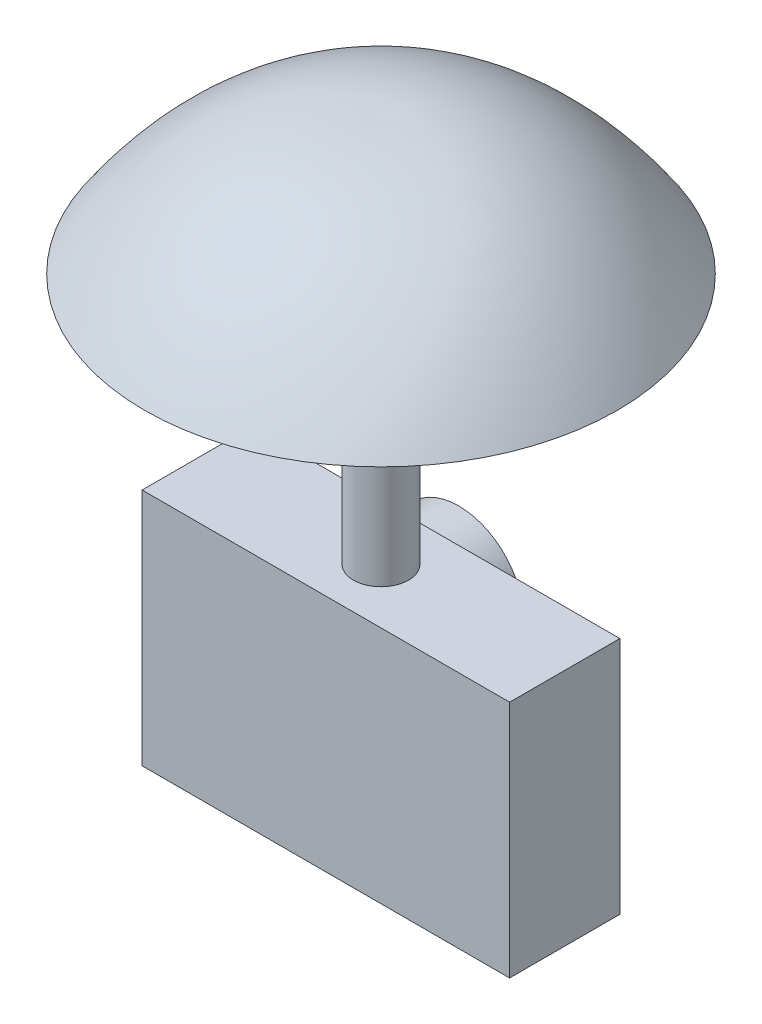
ISO-10303-21;
HEADER;
FILE_DESCRIPTION(('STEP AP214'),'2;1');
FILE_NAME('part.step','',(''),(''),'','','');
FILE_SCHEMA(('AUTOMOTIVE_DESIGN { 1 0 10303 214 1 1 1 1 }'));
ENDSEC;
DATA;
#1=APPLICATION_CONTEXT('core data for automotive mechanical design processes');
#2=APPLICATION_PROTOCOL_DEFINITION('international standard','automotive_design',2000,#1);
#3=PRODUCT_CONTEXT('',#1,'mechanical');
#4=PRODUCT('Part','Part','',(#3));
#5=PRODUCT_RELATED_PRODUCT_CATEGORY('part','',(#4));
#6=PRODUCT_DEFINITION_FORMATION('','',#4);
#7=PRODUCT_DEFINITION_CONTEXT('part definition',#1,'design');
#8=PRODUCT_DEFINITION('design','',#6,#7);
#9=PRODUCT_DEFINITION_SHAPE('','',#8);
#10=(LENGTH_UNIT() NAMED_UNIT(*) SI_UNIT(.MILLI.,.METRE.));
#11=(NAMED_UNIT(*) PLANE_ANGLE_UNIT() SI_UNIT($,.RADIAN.));
#12=(NAMED_UNIT(*) SI_UNIT($,.STERADIAN.) SOLID_ANGLE_UNIT());
#13=UNCERTAINTY_MEASURE_WITH_UNIT(LENGTH_MEASURE(1.E-05),#10,'distance_accuracy_value','');
#14=(GEOMETRIC_REPRESENTATION_CONTEXT(3) GLOBAL_UNCERTAINTY_ASSIGNED_CONTEXT((#13)) GLOBAL_UNIT_ASSIGNED_CONTEXT((#10,
#11,#12)) REPRESENTATION_CONTEXT('',''));
#15=CARTESIAN_POINT('',(0.,0.,0.));
#16=DIRECTION('',(0.,0.,1.));
#17=DIRECTION('',(1.,0.,0.));
#18=AXIS2_PLACEMENT_3D('',#15,#16,#17);
#19=CARTESIAN_POINT('',(0.,13.,0.));
#20=DIRECTION('',(1.,0.,0.));
#21=DIRECTION('',(0.,0.,-1.));
#22=AXIS2_PLACEMENT_3D('',#19,#20,#21);
#23=PLANE('',#22);
#24=DIRECTION('',(0.,0.,1.));
#25=VECTOR('',#24,1.);
#26=CARTESIAN_POINT('',(0.,0.,0.));
#27=LINE('',#26,#25);
#28=CARTESIAN_POINT('',(0.,0.,-6.));
#29=VERTEX_POINT('',#28);
#30=CARTESIAN_POINT('',(0.,0.,0.));
#31=VERTEX_POINT('',#30);
#32=EDGE_CURVE('E100',#29,#31,#27,.T.);
#33=ORIENTED_EDGE('',*,*,#32,.T.);
#34=DIRECTION('',(0.,-1.,0.));
#35=VECTOR('',#34,1.);
#36=CARTESIAN_POINT('',(0.,13.,0.));
#37=LINE('',#36,#35);
#38=CARTESIAN_POINT('',(0.,13.,0.));
#39=VERTEX_POINT('',#38);
#40=EDGE_CURVE('E127',#39,#31,#37,.T.);
#41=ORIENTED_EDGE('',*,*,#40,.F.);
#42=DIRECTION('',(0.,0.,1.));
#43=VECTOR('',#42,1.);
#44=CARTESIAN_POINT('',(0.,13.,0.));
#45=LINE('',#44,#43);
#46=CARTESIAN_POINT('',(0.,13.,-6.));
#47=VERTEX_POINT('',#46);
#48=EDGE_CURVE('E109',#47,#39,#45,.T.);
#49=ORIENTED_EDGE('',*,*,#48,.F.);
#50=DIRECTION('',(0.,-1.,0.));
#51=VECTOR('',#50,1.);
#52=CARTESIAN_POINT('',(0.,13.,-6.));
#53=LINE('',#52,#51);
#54=EDGE_CURVE('E115',#47,#29,#53,.T.);
#55=ORIENTED_EDGE('',*,*,#54,.T.);
#56=EDGE_LOOP('',(#33,#41,#49,#55));
#57=FACE_BOUND('',#56,.T.);
#58=ADVANCED_FACE('F34',(#57),#23,.F.);
#59=CARTESIAN_POINT('',(0.,13.,0.));
#60=DIRECTION('',(0.,0.,-1.));
#61=DIRECTION('',(-1.,0.,0.));
#62=AXIS2_PLACEMENT_3D('',#59,#60,#61);
#63=PLANE('',#62);
#64=DIRECTION('',(1.,0.,0.));
#65=VECTOR('',#64,1.);
#66=CARTESIAN_POINT('',(0.,0.,0.));
#67=LINE('',#66,#65);
#68=CARTESIAN_POINT('',(20.,0.,0.));
#69=VERTEX_POINT('',#68);
#70=EDGE_CURVE('E118',#31,#69,#67,.T.);
#71=ORIENTED_EDGE('',*,*,#70,.T.);
#72=DIRECTION('',(0.,-1.,0.));
#73=VECTOR('',#72,1.);
#74=CARTESIAN_POINT('',(20.,13.,0.));
#75=LINE('',#74,#73);
#76=CARTESIAN_POINT('',(20.,13.,0.));
#77=VERTEX_POINT('',#76);
#78=EDGE_CURVE('E125',#77,#69,#75,.T.);
#79=ORIENTED_EDGE('',*,*,#78,.F.);
#80=DIRECTION('',(1.,0.,0.));
#81=VECTOR('',#80,1.);
#82=CARTESIAN_POINT('',(0.,13.,0.));
#83=LINE('',#82,#81);
#84=EDGE_CURVE('E82',#39,#77,#83,.T.);
#85=ORIENTED_EDGE('',*,*,#84,.F.);
#86=ORIENTED_EDGE('',*,*,#40,.T.);
#87=EDGE_LOOP('',(#71,#79,#85,#86));
#88=FACE_BOUND('',#87,.T.);
#89=ADVANCED_FACE('F146',(#88),#63,.F.);
#90=CARTESIAN_POINT('',(20.,13.,0.));
#91=DIRECTION('',(-1.,0.,0.));
#92=DIRECTION('',(0.,0.,1.));
#93=AXIS2_PLACEMENT_3D('',#90,#91,#92);
#94=PLANE('',#93);
#95=DIRECTION('',(0.,0.,-1.));
#96=VECTOR('',#95,1.);
#97=CARTESIAN_POINT('',(20.,0.,0.));
#98=LINE('',#97,#96);
#99=CARTESIAN_POINT('',(20.,0.,-6.));
#100=VERTEX_POINT('',#99);
#101=EDGE_CURVE('E68',#69,#100,#98,.T.);
#102=ORIENTED_EDGE('',*,*,#101,.T.);
#103=DIRECTION('',(0.,-1.,0.));
#104=VECTOR('',#103,1.);
#105=CARTESIAN_POINT('',(20.,13.,-6.));
#106=LINE('',#105,#104);
#107=CARTESIAN_POINT('',(20.,13.,-6.));
#108=VERTEX_POINT('',#107);
#109=EDGE_CURVE('E123',#108,#100,#106,.T.);
#110=ORIENTED_EDGE('',*,*,#109,.F.);
#111=DIRECTION('',(0.,0.,-1.));
#112=VECTOR('',#111,1.);
#113=CARTESIAN_POINT('',(20.,13.,0.));
#114=LINE('',#113,#112);
#115=EDGE_CURVE('E112',#77,#108,#114,.T.);
#116=ORIENTED_EDGE('',*,*,#115,.F.);
#117=ORIENTED_EDGE('',*,*,#78,.T.);
#118=EDGE_LOOP('',(#102,#110,#116,#117));
#119=FACE_BOUND('',#118,.T.);
#120=ADVANCED_FACE('F149',(#119),#94,.F.);
#121=CARTESIAN_POINT('',(0.,13.,-6.));
#122=DIRECTION('',(0.,0.,1.));
#123=DIRECTION('',(1.,0.,0.));
#124=AXIS2_PLACEMENT_3D('',#121,#122,#123);
#125=PLANE('',#124);
#126=CARTESIAN_POINT('',(6.23550522946914,6.35996969698382,-6.));
#127=DIRECTION('',(0.,0.,1.));
#128=DIRECTION('',(1.,0.,0.));
#129=AXIS2_PLACEMENT_3D('',#126,#127,#128);
#130=CIRCLE('',#129,3.50549754950821);
#131=CARTESIAN_POINT('',(9.74100277897735,6.35996969698382,-6.));
#132=VERTEX_POINT('',#131);
#133=EDGE_CURVE('E11',#132,#132,#130,.F.);
#134=ORIENTED_EDGE('',*,*,#133,.F.);
#135=EDGE_LOOP('',(#134));
#136=FACE_BOUND('',#135,.T.);
#137=DIRECTION('',(-1.,0.,0.));
#138=VECTOR('',#137,1.);
#139=CARTESIAN_POINT('',(0.,0.,-6.));
#140=LINE('',#139,#138);
#141=EDGE_CURVE('E74',#100,#29,#140,.T.);
#142=ORIENTED_EDGE('',*,*,#141,.T.);
#143=ORIENTED_EDGE('',*,*,#54,.F.);
#144=DIRECTION('',(-1.,0.,0.));
#145=VECTOR('',#144,1.);
#146=CARTESIAN_POINT('',(0.,13.,-6.));
#147=LINE('',#146,#145);
#148=EDGE_CURVE('E50',#108,#47,#147,.T.);
#149=ORIENTED_EDGE('',*,*,#148,.F.);
#150=ORIENTED_EDGE('',*,*,#109,.T.);
#151=EDGE_LOOP('',(#142,#143,#149,#150));
#152=FACE_BOUND('',#151,.T.);
#153=ADVANCED_FACE('F140',(#136,#152),#125,.F.);
#154=CARTESIAN_POINT('',(0.,13.,0.));
#155=DIRECTION('',(0.,-1.,0.));
#156=DIRECTION('',(0.,0.,-1.));
#157=AXIS2_PLACEMENT_3D('',#154,#155,#156);
#158=PLANE('',#157);
#159=CARTESIAN_POINT('',(10.,13.,-3.));
#160=DIRECTION('',(0.,-1.,0.));
#161=DIRECTION('',(0.,0.,-1.));
#162=AXIS2_PLACEMENT_3D('',#159,#160,#161);
#163=CIRCLE('',#162,1.5);
#164=CARTESIAN_POINT('',(10.,13.,-4.5));
#165=VERTEX_POINT('',#164);
#166=EDGE_CURVE('E96',#165,#165,#163,.T.);
#167=ORIENTED_EDGE('',*,*,#166,.T.);
#168=EDGE_LOOP('',(#167));
#169=FACE_BOUND('',#168,.T.);
#170=ORIENTED_EDGE('',*,*,#48,.T.);
#171=ORIENTED_EDGE('',*,*,#84,.T.);
#172=ORIENTED_EDGE('',*,*,#115,.T.);
#173=ORIENTED_EDGE('',*,*,#148,.T.);
#174=EDGE_LOOP('',(#170,#171,#172,#173));
#175=FACE_BOUND('',#174,.T.);
#176=ADVANCED_FACE('F138',(#169,#175),#158,.F.);
#177=CARTESIAN_POINT('',(0.,0.,0.));
#178=DIRECTION('',(0.,-1.,0.));
#179=DIRECTION('',(0.,0.,-1.));
#180=AXIS2_PLACEMENT_3D('',#177,#178,#179);
#181=PLANE('',#180);
#182=ORIENTED_EDGE('',*,*,#32,.F.);
#183=ORIENTED_EDGE('',*,*,#141,.F.);
#184=ORIENTED_EDGE('',*,*,#101,.F.);
#185=ORIENTED_EDGE('',*,*,#70,.F.);
#186=EDGE_LOOP('',(#182,#183,#184,#185));
#187=FACE_BOUND('',#186,.T.);
#188=ADVANCED_FACE('F134',(#187),#181,.T.);
#189=CARTESIAN_POINT('',(10.,34.,-3.));
#190=DIRECTION('',(0.,-1.,0.));
#191=DIRECTION('',(0.,0.,-1.));
#192=AXIS2_PLACEMENT_3D('',#189,#190,#191);
#193=CYLINDRICAL_SURFACE('',#192,1.5);
#194=CARTESIAN_POINT('',(10.,26.6871641873127,-3.));
#195=DIRECTION('',(0.,-1.,0.));
#196=DIRECTION('',(0.,0.,-1.));
#197=AXIS2_PLACEMENT_3D('',#194,#195,#196);
#198=CIRCLE('',#197,1.5);
#199=CARTESIAN_POINT('',(10.,26.6871641873127,-4.5));
#200=VERTEX_POINT('',#199);
#201=EDGE_CURVE('E42',#200,#200,#198,.F.);
#202=ORIENTED_EDGE('',*,*,#201,.F.);
#203=EDGE_LOOP('',(#202));
#204=FACE_BOUND('',#203,.T.);
#205=ORIENTED_EDGE('',*,*,#166,.F.);
#206=EDGE_LOOP('',(#205));
#207=FACE_BOUND('',#206,.T.);
#208=ADVANCED_FACE('F90',(#204,#207),#193,.T.);
#209=CARTESIAN_POINT('',(10.,34.,-3.));
#210=CARTESIAN_POINT('',(2.37308075307496,34.4058088395215,-3.));
#211=CARTESIAN_POINT('',(-2.86598770863695,26.6871641873127,-3.));
#212=B_SPLINE_CURVE_WITH_KNOTS('',2,(#209,#210,#211),.UNSPECIFIED.,.F.,.F.,(3,3),(0.,1.),.UNSPECIFIED.);
#213=CARTESIAN_POINT('',(10.,34.,-3.));
#214=DIRECTION('',(0.,1.,0.));
#215=AXIS1_PLACEMENT('',#213,#214);
#216=SURFACE_OF_REVOLUTION('',#212,#215);
#217=CARTESIAN_POINT('',(10.,34.,-3.));
#218=VERTEX_POINT('',#217);
#219=VERTEX_LOOP('',#218);
#220=FACE_BOUND('',#219,.T.);
#221=CARTESIAN_POINT('',(10.,26.6871641873127,-3.));
#222=DIRECTION('',(0.,1.,0.));
#223=DIRECTION('',(0.,0.,1.));
#224=AXIS2_PLACEMENT_3D('',#221,#222,#223);
#225=CIRCLE('',#224,12.8659877086369);
#226=CARTESIAN_POINT('',(10.,26.6871641873127,9.86598770863695));
#227=VERTEX_POINT('',#226);
#228=EDGE_CURVE('E94',#227,#227,#225,.T.);
#229=ORIENTED_EDGE('',*,*,#228,.T.);
#230=EDGE_LOOP('',(#229));
#231=FACE_BOUND('',#230,.T.);
#232=ADVANCED_FACE('F86',(#220,#231),#216,.F.);
#233=CARTESIAN_POINT('',(10.,26.6871641873127,-3.));
#234=DIRECTION('',(0.,-1.,0.));
#235=DIRECTION('',(0.,0.,-1.));
#236=AXIS2_PLACEMENT_3D('',#233,#234,#235);
#237=PLANE('',#236);
#238=ORIENTED_EDGE('',*,*,#201,.T.);
#239=EDGE_LOOP('',(#238));
#240=FACE_BOUND('',#239,.T.);
#241=ORIENTED_EDGE('',*,*,#228,.F.);
#242=EDGE_LOOP('',(#241));
#243=FACE_BOUND('',#242,.T.);
#244=ADVANCED_FACE('F89',(#240,#243),#237,.T.);
#245=CARTESIAN_POINT('',(6.23550522946914,6.35996969698382,-11.));
#246=DIRECTION('',(0.,0.,1.));
#247=DIRECTION('',(1.,0.,0.));
#248=AXIS2_PLACEMENT_3D('',#245,#246,#247);
#249=CYLINDRICAL_SURFACE('',#248,3.50549754950821);
#250=CARTESIAN_POINT('',(6.23550522946914,6.35996969698382,-11.));
#251=DIRECTION('',(0.,0.,-1.));
#252=DIRECTION('',(-1.,0.,0.));
#253=AXIS2_PLACEMENT_3D('',#250,#251,#252);
#254=CIRCLE('',#253,3.50549754950821);
#255=CARTESIAN_POINT('',(2.73000767996093,6.35996969698382,-11.));
#256=VERTEX_POINT('',#255);
#257=EDGE_CURVE('E97',#256,#256,#254,.T.);
#258=ORIENTED_EDGE('',*,*,#257,.F.);
#259=EDGE_LOOP('',(#258));
#260=FACE_BOUND('',#259,.T.);
#261=ORIENTED_EDGE('',*,*,#133,.T.);
#262=EDGE_LOOP('',(#261));
#263=FACE_BOUND('',#262,.T.);
#264=ADVANCED_FACE('F169',(#260,#263),#249,.T.);
#265=CARTESIAN_POINT('',(6.23550522946914,6.35996969698382,-11.));
#266=DIRECTION('',(0.,0.,-1.));
#267=DIRECTION('',(-1.,0.,0.));
#268=AXIS2_PLACEMENT_3D('',#265,#266,#267);
#269=PLANE('',#268);
#270=ORIENTED_EDGE('',*,*,#257,.T.);
#271=EDGE_LOOP('',(#270));
#272=FACE_BOUND('',#271,.T.);
#273=ADVANCED_FACE('F171',(#272),#269,.T.);
#274=CLOSED_SHELL('',(#58,#89,#120,#153,#176,#188,#208,#232,#244,#264,#273));
#275=MANIFOLD_SOLID_BREP('B2',#274);
#276=ADVANCED_BREP_SHAPE_REPRESENTATION('',(#18,#275),#14);
#277=SHAPE_DEFINITION_REPRESENTATION(#9,#276);
ENDSEC;
END-ISO-10303-21;
